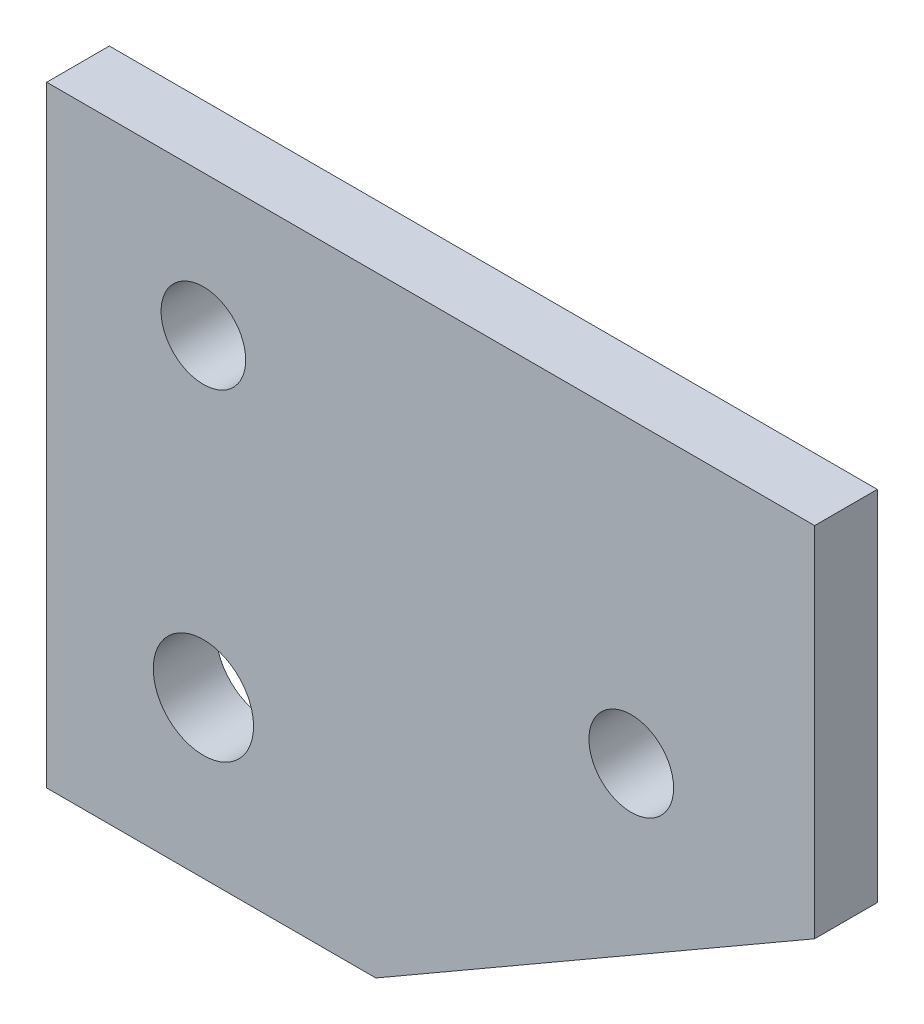
ISO-10303-21;
HEADER;
FILE_DESCRIPTION(('STEP AP214'),'2;1');
FILE_NAME('part.step','',(''),(''),'','','');
FILE_SCHEMA(('AUTOMOTIVE_DESIGN { 1 0 10303 214 1 1 1 1 }'));
ENDSEC;
DATA;
#1=APPLICATION_CONTEXT('core data for automotive mechanical design processes');
#2=APPLICATION_PROTOCOL_DEFINITION('international standard','automotive_design',2000,#1);
#3=PRODUCT_CONTEXT('',#1,'mechanical');
#4=PRODUCT('Part','Part','',(#3));
#5=PRODUCT_RELATED_PRODUCT_CATEGORY('part','',(#4));
#6=PRODUCT_DEFINITION_FORMATION('','',#4);
#7=PRODUCT_DEFINITION_CONTEXT('part definition',#1,'design');
#8=PRODUCT_DEFINITION('design','',#6,#7);
#9=PRODUCT_DEFINITION_SHAPE('','',#8);
#10=(LENGTH_UNIT() NAMED_UNIT(*) SI_UNIT(.MILLI.,.METRE.));
#11=(NAMED_UNIT(*) PLANE_ANGLE_UNIT() SI_UNIT($,.RADIAN.));
#12=(NAMED_UNIT(*) SI_UNIT($,.STERADIAN.) SOLID_ANGLE_UNIT());
#13=UNCERTAINTY_MEASURE_WITH_UNIT(LENGTH_MEASURE(1.E-05),#10,'distance_accuracy_value','');
#14=(GEOMETRIC_REPRESENTATION_CONTEXT(3) GLOBAL_UNCERTAINTY_ASSIGNED_CONTEXT((#13)) GLOBAL_UNIT_ASSIGNED_CONTEXT((#10,
#11,#12)) REPRESENTATION_CONTEXT('',''));
#15=CARTESIAN_POINT('',(0.,0.,0.));
#16=DIRECTION('',(0.,0.,1.));
#17=DIRECTION('',(1.,0.,0.));
#18=AXIS2_PLACEMENT_3D('',#15,#16,#17);
#19=CARTESIAN_POINT('',(-56.4287972565284,-17.8859136093122,4.));
#20=DIRECTION('',(0.,0.,1.));
#21=DIRECTION('',(1.,0.,0.));
#22=AXIS2_PLACEMENT_3D('',#19,#20,#21);
#23=PLANE('',#22);
#24=CARTESIAN_POINT('',(-46.4287972565284,12.1140863906878,4.));
#25=DIRECTION('',(0.,0.,1.));
#26=DIRECTION('',(1.,0.,0.));
#27=AXIS2_PLACEMENT_3D('',#24,#25,#26);
#28=CIRCLE('',#27,2.7);
#29=CARTESIAN_POINT('',(-43.7287972565284,12.1140863906878,4.));
#30=VERTEX_POINT('',#29);
#31=EDGE_CURVE('E133',#30,#30,#28,.F.);
#32=ORIENTED_EDGE('',*,*,#31,.T.);
#33=EDGE_LOOP('',(#32));
#34=FACE_BOUND('',#33,.T.);
#35=DIRECTION('',(1.,0.,0.));
#36=VECTOR('',#35,1.);
#37=CARTESIAN_POINT('',(-56.4287972565284,-17.8859136093122,4.));
#38=LINE('',#37,#36);
#39=CARTESIAN_POINT('',(-56.4287972565284,-17.8859136093122,4.));
#40=VERTEX_POINT('',#39);
#41=CARTESIAN_POINT('',(-35.4287972565284,-17.8859136093122,4.));
#42=VERTEX_POINT('',#41);
#43=EDGE_CURVE('E78',#40,#42,#38,.T.);
#44=ORIENTED_EDGE('',*,*,#43,.T.);
#45=DIRECTION('',(0.866025403784442,0.499999999999995,0.));
#46=VECTOR('',#45,1.);
#47=CARTESIAN_POINT('',(-51.1787972565285,-26.9791803490488,4.));
#48=LINE('',#47,#46);
#49=CARTESIAN_POINT('',(-7.42879725652838,-1.72010607200293,4.));
#50=VERTEX_POINT('',#49);
#51=EDGE_CURVE('E86',#42,#50,#48,.T.);
#52=ORIENTED_EDGE('',*,*,#51,.T.);
#53=DIRECTION('',(0.,1.,0.));
#54=VECTOR('',#53,1.);
#55=CARTESIAN_POINT('',(-7.4287972565284,21.1140863906878,4.));
#56=LINE('',#55,#54);
#57=CARTESIAN_POINT('',(-7.4287972565284,21.1140863906878,4.));
#58=VERTEX_POINT('',#57);
#59=EDGE_CURVE('E101',#50,#58,#56,.T.);
#60=ORIENTED_EDGE('',*,*,#59,.T.);
#61=DIRECTION('',(-1.,0.,0.));
#62=VECTOR('',#61,1.);
#63=CARTESIAN_POINT('',(-56.4287972565284,21.1140863906878,4.));
#64=LINE('',#63,#62);
#65=CARTESIAN_POINT('',(-56.4287972565284,21.1140863906878,4.));
#66=VERTEX_POINT('',#65);
#67=EDGE_CURVE('E55',#58,#66,#64,.T.);
#68=ORIENTED_EDGE('',*,*,#67,.T.);
#69=DIRECTION('',(0.,-1.,0.));
#70=VECTOR('',#69,1.);
#71=CARTESIAN_POINT('',(-56.4287972565284,21.1140863906878,4.));
#72=LINE('',#71,#70);
#73=EDGE_CURVE('E99',#66,#40,#72,.T.);
#74=ORIENTED_EDGE('',*,*,#73,.T.);
#75=EDGE_LOOP('',(#44,#52,#60,#68,#74));
#76=FACE_BOUND('',#75,.T.);
#77=CARTESIAN_POINT('',(-19.1287972565284,2.11408639068778,4.));
#78=DIRECTION('',(0.,0.,1.));
#79=DIRECTION('',(1.,0.,0.));
#80=AXIS2_PLACEMENT_3D('',#77,#78,#79);
#81=CIRCLE('',#80,2.7);
#82=CARTESIAN_POINT('',(-16.4287972565284,2.11408639068778,4.));
#83=VERTEX_POINT('',#82);
#84=EDGE_CURVE('E95',#83,#83,#81,.F.);
#85=ORIENTED_EDGE('',*,*,#84,.T.);
#86=EDGE_LOOP('',(#85));
#87=FACE_BOUND('',#86,.T.);
#88=CARTESIAN_POINT('',(-46.4287972565284,-7.88591360931223,4.));
#89=DIRECTION('',(0.,0.,1.));
#90=DIRECTION('',(1.,0.,0.));
#91=AXIS2_PLACEMENT_3D('',#88,#89,#90);
#92=CIRCLE('',#91,3.2);
#93=CARTESIAN_POINT('',(-43.2287972565284,-7.88591360931223,4.));
#94=VERTEX_POINT('',#93);
#95=EDGE_CURVE('E139',#94,#94,#92,.F.);
#96=ORIENTED_EDGE('',*,*,#95,.T.);
#97=EDGE_LOOP('',(#96));
#98=FACE_BOUND('',#97,.T.);
#99=ADVANCED_FACE('F32',(#34,#76,#87,#98),#23,.T.);
#100=CARTESIAN_POINT('',(-56.4287972565284,-17.8859136093122,0.));
#101=DIRECTION('',(0.,0.,1.));
#102=DIRECTION('',(1.,0.,0.));
#103=AXIS2_PLACEMENT_3D('',#100,#101,#102);
#104=PLANE('',#103);
#105=CARTESIAN_POINT('',(-46.4287972565284,12.1140863906878,0.));
#106=DIRECTION('',(0.,0.,1.));
#107=DIRECTION('',(1.,0.,0.));
#108=AXIS2_PLACEMENT_3D('',#105,#106,#107);
#109=CIRCLE('',#108,2.7);
#110=CARTESIAN_POINT('',(-43.7287972565284,12.1140863906878,0.));
#111=VERTEX_POINT('',#110);
#112=EDGE_CURVE('E136',#111,#111,#109,.T.);
#113=ORIENTED_EDGE('',*,*,#112,.T.);
#114=EDGE_LOOP('',(#113));
#115=FACE_BOUND('',#114,.T.);
#116=DIRECTION('',(0.866025403784442,0.499999999999995,0.));
#117=VECTOR('',#116,1.);
#118=CARTESIAN_POINT('',(-51.1787972565285,-26.9791803490488,0.));
#119=LINE('',#118,#117);
#120=CARTESIAN_POINT('',(-35.4287972565284,-17.8859136093122,0.));
#121=VERTEX_POINT('',#120);
#122=CARTESIAN_POINT('',(-7.42879725652837,-1.72010607200293,0.));
#123=VERTEX_POINT('',#122);
#124=EDGE_CURVE('E11',#121,#123,#119,.T.);
#125=ORIENTED_EDGE('',*,*,#124,.F.);
#126=DIRECTION('',(1.,0.,0.));
#127=VECTOR('',#126,1.);
#128=CARTESIAN_POINT('',(-56.4287972565284,-17.8859136093122,0.));
#129=LINE('',#128,#127);
#130=CARTESIAN_POINT('',(-56.4287972565284,-17.8859136093122,0.));
#131=VERTEX_POINT('',#130);
#132=EDGE_CURVE('E94',#131,#121,#129,.T.);
#133=ORIENTED_EDGE('',*,*,#132,.F.);
#134=DIRECTION('',(0.,-1.,0.));
#135=VECTOR('',#134,1.);
#136=CARTESIAN_POINT('',(-56.4287972565284,21.1140863906878,0.));
#137=LINE('',#136,#135);
#138=CARTESIAN_POINT('',(-56.4287972565284,21.1140863906878,0.));
#139=VERTEX_POINT('',#138);
#140=EDGE_CURVE('E109',#139,#131,#137,.T.);
#141=ORIENTED_EDGE('',*,*,#140,.F.);
#142=DIRECTION('',(-1.,0.,0.));
#143=VECTOR('',#142,1.);
#144=CARTESIAN_POINT('',(-56.4287972565284,21.1140863906878,0.));
#145=LINE('',#144,#143);
#146=CARTESIAN_POINT('',(-7.4287972565284,21.1140863906878,0.));
#147=VERTEX_POINT('',#146);
#148=EDGE_CURVE('E72',#147,#139,#145,.T.);
#149=ORIENTED_EDGE('',*,*,#148,.F.);
#150=DIRECTION('',(0.,1.,0.));
#151=VECTOR('',#150,1.);
#152=CARTESIAN_POINT('',(-7.4287972565284,21.1140863906878,0.));
#153=LINE('',#152,#151);
#154=EDGE_CURVE('E113',#123,#147,#153,.T.);
#155=ORIENTED_EDGE('',*,*,#154,.F.);
#156=EDGE_LOOP('',(#125,#133,#141,#149,#155));
#157=FACE_BOUND('',#156,.T.);
#158=CARTESIAN_POINT('',(-19.1287972565284,2.11408639068778,0.));
#159=DIRECTION('',(0.,0.,1.));
#160=DIRECTION('',(1.,0.,0.));
#161=AXIS2_PLACEMENT_3D('',#158,#159,#160);
#162=CIRCLE('',#161,2.7);
#163=CARTESIAN_POINT('',(-16.4287972565284,2.11408639068778,0.));
#164=VERTEX_POINT('',#163);
#165=EDGE_CURVE('E130',#164,#164,#162,.T.);
#166=ORIENTED_EDGE('',*,*,#165,.T.);
#167=EDGE_LOOP('',(#166));
#168=FACE_BOUND('',#167,.T.);
#169=CARTESIAN_POINT('',(-46.4287972565284,-7.88591360931223,0.));
#170=DIRECTION('',(0.,0.,1.));
#171=DIRECTION('',(1.,0.,0.));
#172=AXIS2_PLACEMENT_3D('',#169,#170,#171);
#173=CIRCLE('',#172,3.2);
#174=CARTESIAN_POINT('',(-43.2287972565284,-7.88591360931223,0.));
#175=VERTEX_POINT('',#174);
#176=EDGE_CURVE('E142',#175,#175,#173,.T.);
#177=ORIENTED_EDGE('',*,*,#176,.T.);
#178=EDGE_LOOP('',(#177));
#179=FACE_BOUND('',#178,.T.);
#180=ADVANCED_FACE('F121',(#115,#157,#168,#179),#104,.F.);
#181=CARTESIAN_POINT('',(-56.4287972565284,-17.8859136093122,4.));
#182=DIRECTION('',(0.,1.,0.));
#183=DIRECTION('',(0.,0.,1.));
#184=AXIS2_PLACEMENT_3D('',#181,#182,#183);
#185=PLANE('',#184);
#186=DIRECTION('',(0.,0.,-1.));
#187=VECTOR('',#186,1.);
#188=CARTESIAN_POINT('',(-35.4287972565284,-17.8859136093122,13.));
#189=LINE('',#188,#187);
#190=EDGE_CURVE('E46',#42,#121,#189,.T.);
#191=ORIENTED_EDGE('',*,*,#190,.F.);
#192=ORIENTED_EDGE('',*,*,#43,.F.);
#193=DIRECTION('',(0.,0.,-1.));
#194=VECTOR('',#193,1.);
#195=CARTESIAN_POINT('',(-56.4287972565284,-17.8859136093122,4.));
#196=LINE('',#195,#194);
#197=EDGE_CURVE('E40',#40,#131,#196,.T.);
#198=ORIENTED_EDGE('',*,*,#197,.T.);
#199=ORIENTED_EDGE('',*,*,#132,.T.);
#200=EDGE_LOOP('',(#191,#192,#198,#199));
#201=FACE_BOUND('',#200,.T.);
#202=ADVANCED_FACE('F93',(#201),#185,.F.);
#203=CARTESIAN_POINT('',(-7.4287972565284,21.1140863906878,4.));
#204=DIRECTION('',(-1.,0.,0.));
#205=DIRECTION('',(0.,-1.,0.));
#206=AXIS2_PLACEMENT_3D('',#203,#204,#205);
#207=PLANE('',#206);
#208=DIRECTION('',(0.,0.,1.));
#209=VECTOR('',#208,1.);
#210=CARTESIAN_POINT('',(-7.42879725652838,-1.72010607200294,4.));
#211=LINE('',#210,#209);
#212=EDGE_CURVE('E89',#123,#50,#211,.T.);
#213=ORIENTED_EDGE('',*,*,#212,.F.);
#214=ORIENTED_EDGE('',*,*,#154,.T.);
#215=DIRECTION('',(0.,0.,-1.));
#216=VECTOR('',#215,1.);
#217=CARTESIAN_POINT('',(-7.4287972565284,21.1140863906878,4.));
#218=LINE('',#217,#216);
#219=EDGE_CURVE('E117',#58,#147,#218,.T.);
#220=ORIENTED_EDGE('',*,*,#219,.F.);
#221=ORIENTED_EDGE('',*,*,#59,.F.);
#222=EDGE_LOOP('',(#213,#214,#220,#221));
#223=FACE_BOUND('',#222,.T.);
#224=ADVANCED_FACE('F125',(#223),#207,.F.);
#225=CARTESIAN_POINT('',(-56.4287972565284,21.1140863906878,4.));
#226=DIRECTION('',(1.,0.,0.));
#227=DIRECTION('',(0.,1.,0.));
#228=AXIS2_PLACEMENT_3D('',#225,#226,#227);
#229=PLANE('',#228);
#230=ORIENTED_EDGE('',*,*,#140,.T.);
#231=ORIENTED_EDGE('',*,*,#197,.F.);
#232=ORIENTED_EDGE('',*,*,#73,.F.);
#233=DIRECTION('',(0.,0.,-1.));
#234=VECTOR('',#233,1.);
#235=CARTESIAN_POINT('',(-56.4287972565284,21.1140863906878,4.));
#236=LINE('',#235,#234);
#237=EDGE_CURVE('E108',#66,#139,#236,.T.);
#238=ORIENTED_EDGE('',*,*,#237,.T.);
#239=EDGE_LOOP('',(#230,#231,#232,#238));
#240=FACE_BOUND('',#239,.T.);
#241=ADVANCED_FACE('F34',(#240),#229,.F.);
#242=CARTESIAN_POINT('',(-56.4287972565284,21.1140863906878,4.));
#243=DIRECTION('',(0.,-1.,0.));
#244=DIRECTION('',(0.,0.,-1.));
#245=AXIS2_PLACEMENT_3D('',#242,#243,#244);
#246=PLANE('',#245);
#247=ORIENTED_EDGE('',*,*,#148,.T.);
#248=ORIENTED_EDGE('',*,*,#237,.F.);
#249=ORIENTED_EDGE('',*,*,#67,.F.);
#250=ORIENTED_EDGE('',*,*,#219,.T.);
#251=EDGE_LOOP('',(#247,#248,#249,#250));
#252=FACE_BOUND('',#251,.T.);
#253=ADVANCED_FACE('F170',(#252),#246,.F.);
#254=CARTESIAN_POINT('',(-35.4287972565284,-17.8859136093122,13.));
#255=DIRECTION('',(0.499999999999995,-0.866025403784442,0.));
#256=DIRECTION('',(0.866025403784442,0.499999999999995,0.));
#257=AXIS2_PLACEMENT_3D('',#254,#255,#256);
#258=PLANE('',#257);
#259=ORIENTED_EDGE('',*,*,#212,.T.);
#260=ORIENTED_EDGE('',*,*,#51,.F.);
#261=ORIENTED_EDGE('',*,*,#190,.T.);
#262=ORIENTED_EDGE('',*,*,#124,.T.);
#263=EDGE_LOOP('',(#259,#260,#261,#262));
#264=FACE_BOUND('',#263,.T.);
#265=ADVANCED_FACE('F87',(#264),#258,.T.);
#266=CARTESIAN_POINT('',(-19.1287972565284,2.11408639068778,17.));
#267=DIRECTION('',(0.,0.,-1.));
#268=DIRECTION('',(-1.,0.,0.));
#269=AXIS2_PLACEMENT_3D('',#266,#267,#268);
#270=CYLINDRICAL_SURFACE('',#269,2.7);
#271=ORIENTED_EDGE('',*,*,#84,.F.);
#272=EDGE_LOOP('',(#271));
#273=FACE_BOUND('',#272,.T.);
#274=ORIENTED_EDGE('',*,*,#165,.F.);
#275=EDGE_LOOP('',(#274));
#276=FACE_BOUND('',#275,.T.);
#277=ADVANCED_FACE('F155',(#273,#276),#270,.F.);
#278=CARTESIAN_POINT('',(-46.4287972565284,12.1140863906878,17.));
#279=DIRECTION('',(0.,0.,-1.));
#280=DIRECTION('',(-1.,0.,0.));
#281=AXIS2_PLACEMENT_3D('',#278,#279,#280);
#282=CYLINDRICAL_SURFACE('',#281,2.7);
#283=ORIENTED_EDGE('',*,*,#31,.F.);
#284=EDGE_LOOP('',(#283));
#285=FACE_BOUND('',#284,.T.);
#286=ORIENTED_EDGE('',*,*,#112,.F.);
#287=EDGE_LOOP('',(#286));
#288=FACE_BOUND('',#287,.T.);
#289=ADVANCED_FACE('F149',(#285,#288),#282,.F.);
#290=CARTESIAN_POINT('',(-46.4287972565284,-7.88591360931223,17.));
#291=DIRECTION('',(0.,0.,-1.));
#292=DIRECTION('',(-1.,0.,0.));
#293=AXIS2_PLACEMENT_3D('',#290,#291,#292);
#294=CYLINDRICAL_SURFACE('',#293,3.2);
#295=ORIENTED_EDGE('',*,*,#95,.F.);
#296=EDGE_LOOP('',(#295));
#297=FACE_BOUND('',#296,.T.);
#298=ORIENTED_EDGE('',*,*,#176,.F.);
#299=EDGE_LOOP('',(#298));
#300=FACE_BOUND('',#299,.T.);
#301=ADVANCED_FACE('F147',(#297,#300),#294,.F.);
#302=CLOSED_SHELL('',(#99,#180,#202,#224,#241,#253,#265,#277,#289,#301));
#303=MANIFOLD_SOLID_BREP('B2',#302);
#304=ADVANCED_BREP_SHAPE_REPRESENTATION('',(#18,#303),#14);
#305=SHAPE_DEFINITION_REPRESENTATION(#9,#304);
ENDSEC;
END-ISO-10303-21;
